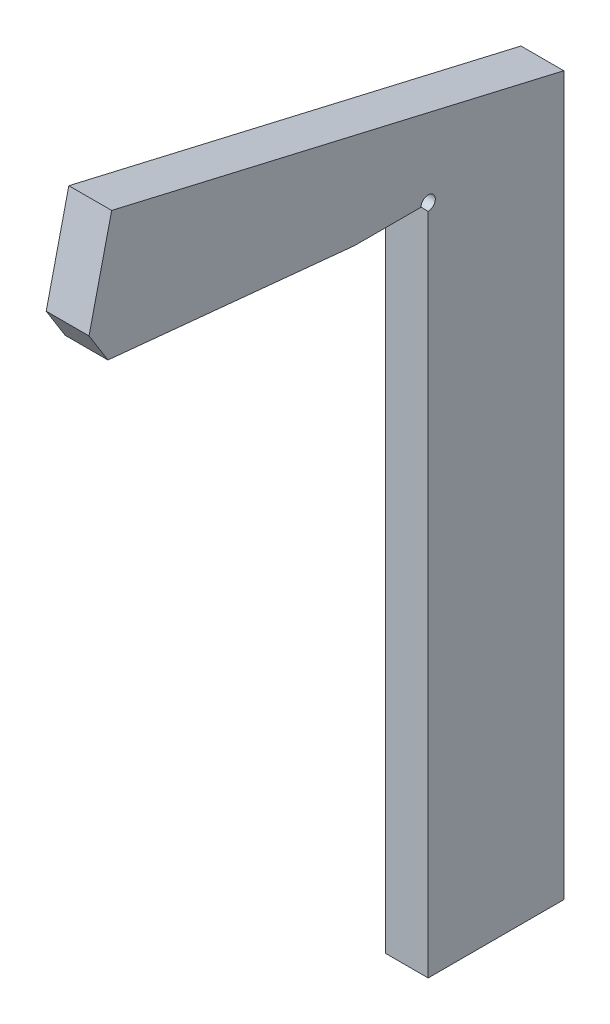
ISO-10303-21;
HEADER;
FILE_DESCRIPTION(('STEP AP214'),'2;1');
FILE_NAME('part.step','',(''),(''),'','','');
FILE_SCHEMA(('AUTOMOTIVE_DESIGN { 1 0 10303 214 1 1 1 1 }'));
ENDSEC;
DATA;
#1=APPLICATION_CONTEXT('core data for automotive mechanical design processes');
#2=APPLICATION_PROTOCOL_DEFINITION('international standard','automotive_design',2000,#1);
#3=PRODUCT_CONTEXT('',#1,'mechanical');
#4=PRODUCT('Part','Part','',(#3));
#5=PRODUCT_RELATED_PRODUCT_CATEGORY('part','',(#4));
#6=PRODUCT_DEFINITION_FORMATION('','',#4);
#7=PRODUCT_DEFINITION_CONTEXT('part definition',#1,'design');
#8=PRODUCT_DEFINITION('design','',#6,#7);
#9=PRODUCT_DEFINITION_SHAPE('','',#8);
#10=(LENGTH_UNIT() NAMED_UNIT(*) SI_UNIT(.MILLI.,.METRE.));
#11=(NAMED_UNIT(*) PLANE_ANGLE_UNIT() SI_UNIT($,.RADIAN.));
#12=(NAMED_UNIT(*) SI_UNIT($,.STERADIAN.) SOLID_ANGLE_UNIT());
#13=UNCERTAINTY_MEASURE_WITH_UNIT(LENGTH_MEASURE(1.E-05),#10,'distance_accuracy_value','');
#14=(GEOMETRIC_REPRESENTATION_CONTEXT(3) GLOBAL_UNCERTAINTY_ASSIGNED_CONTEXT((#13)) GLOBAL_UNIT_ASSIGNED_CONTEXT((#10,
#11,#12)) REPRESENTATION_CONTEXT('',''));
#15=CARTESIAN_POINT('',(0.,0.,0.));
#16=DIRECTION('',(0.,0.,1.));
#17=DIRECTION('',(1.,0.,0.));
#18=AXIS2_PLACEMENT_3D('',#15,#16,#17);
#19=CARTESIAN_POINT('',(-94.738766336441,-298.45,0.));
#20=DIRECTION('',(0.,0.,1.));
#21=DIRECTION('',(0.,-1.,0.));
#22=AXIS2_PLACEMENT_3D('',#19,#20,#21);
#23=PLANE('',#22);
#24=DIRECTION('',(0.,1.,0.));
#25=VECTOR('',#24,1.);
#26=CARTESIAN_POINT('',(-113.788766336441,-298.45,0.));
#27=LINE('',#26,#25);
#28=CARTESIAN_POINT('',(-113.788766336441,-298.45,0.));
#29=VERTEX_POINT('',#28);
#30=CARTESIAN_POINT('',(-113.788766336441,20.8246330030021,0.));
#31=VERTEX_POINT('',#30);
#32=EDGE_CURVE('E122',#29,#31,#27,.T.);
#33=ORIENTED_EDGE('',*,*,#32,.T.);
#34=DIRECTION('',(-1.,0.,0.));
#35=VECTOR('',#34,1.);
#36=CARTESIAN_POINT('',(-94.738766336441,20.8246330030021,0.));
#37=LINE('',#36,#35);
#38=CARTESIAN_POINT('',(-94.738766336441,20.8246330030021,0.));
#39=VERTEX_POINT('',#38);
#40=EDGE_CURVE('E161',#39,#31,#37,.T.);
#41=ORIENTED_EDGE('',*,*,#40,.F.);
#42=DIRECTION('',(0.,1.,0.));
#43=VECTOR('',#42,1.);
#44=CARTESIAN_POINT('',(-94.738766336441,-298.45,0.));
#45=LINE('',#44,#43);
#46=CARTESIAN_POINT('',(-94.738766336441,-298.45,0.));
#47=VERTEX_POINT('',#46);
#48=EDGE_CURVE('E113',#47,#39,#45,.T.);
#49=ORIENTED_EDGE('',*,*,#48,.F.);
#50=DIRECTION('',(-1.,0.,0.));
#51=VECTOR('',#50,1.);
#52=CARTESIAN_POINT('',(-94.738766336441,-298.45,0.));
#53=LINE('',#52,#51);
#54=EDGE_CURVE('E138',#47,#29,#53,.T.);
#55=ORIENTED_EDGE('',*,*,#54,.T.);
#56=EDGE_LOOP('',(#33,#41,#49,#55));
#57=FACE_BOUND('',#56,.T.);
#58=ADVANCED_FACE('F33',(#57),#23,.F.);
#59=CARTESIAN_POINT('',(-94.738766336441,20.8246330030021,0.));
#60=DIRECTION('',(0.,-0.974040610761285,0.22637333895091));
#61=DIRECTION('',(0.,-0.22637333895091,-0.974040610761285));
#62=AXIS2_PLACEMENT_3D('',#59,#60,#61);
#63=PLANE('',#62);
#64=DIRECTION('',(0.,0.22637333895091,0.974040610761284));
#65=VECTOR('',#64,1.);
#66=CARTESIAN_POINT('',(-113.788766336441,20.8246330030021,0.));
#67=LINE('',#66,#65);
#68=CARTESIAN_POINT('',(-113.788766336441,67.5582448491421,201.0856757101));
#69=VERTEX_POINT('',#68);
#70=EDGE_CURVE('E121',#31,#69,#67,.T.);
#71=ORIENTED_EDGE('',*,*,#70,.T.);
#72=DIRECTION('',(-1.,0.,0.));
#73=VECTOR('',#72,1.);
#74=CARTESIAN_POINT('',(-94.738766336441,67.5582448491421,201.0856757101));
#75=LINE('',#74,#73);
#76=CARTESIAN_POINT('',(-94.738766336441,67.5582448491421,201.0856757101));
#77=VERTEX_POINT('',#76);
#78=EDGE_CURVE('E104',#77,#69,#75,.T.);
#79=ORIENTED_EDGE('',*,*,#78,.F.);
#80=DIRECTION('',(0.,0.22637333895091,0.974040610761284));
#81=VECTOR('',#80,1.);
#82=CARTESIAN_POINT('',(-94.738766336441,20.8246330030021,0.));
#83=LINE('',#82,#81);
#84=EDGE_CURVE('E110',#39,#77,#83,.T.);
#85=ORIENTED_EDGE('',*,*,#84,.F.);
#86=ORIENTED_EDGE('',*,*,#40,.T.);
#87=EDGE_LOOP('',(#71,#79,#85,#86));
#88=FACE_BOUND('',#87,.T.);
#89=ADVANCED_FACE('F120',(#88),#63,.F.);
#90=CARTESIAN_POINT('',(-94.738766336441,0.,93.1961939808879));
#91=DIRECTION('',(0.,1.,0.));
#92=DIRECTION('',(0.,0.,1.));
#93=AXIS2_PLACEMENT_3D('',#90,#91,#92);
#94=PLANE('',#93);
#95=DIRECTION('',(0.,0.,-1.));
#96=VECTOR('',#95,1.);
#97=CARTESIAN_POINT('',(-113.788766336441,0.,93.1961939808879));
#98=LINE('',#97,#96);
#99=CARTESIAN_POINT('',(-113.788766336441,0.,93.1961939808879));
#100=VERTEX_POINT('',#99);
#101=CARTESIAN_POINT('',(-113.788766336441,8.23729306522208E-13,63.5));
#102=VERTEX_POINT('',#101);
#103=EDGE_CURVE('E141',#100,#102,#98,.T.);
#104=ORIENTED_EDGE('',*,*,#103,.T.);
#105=DIRECTION('',(-1.,0.,0.));
#106=VECTOR('',#105,1.);
#107=CARTESIAN_POINT('',(-94.738766336441,8.23729306522208E-13,63.5));
#108=LINE('',#107,#106);
#109=CARTESIAN_POINT('',(-94.738766336441,8.23729306522208E-13,63.5));
#110=VERTEX_POINT('',#109);
#111=EDGE_CURVE('E156',#110,#102,#108,.T.);
#112=ORIENTED_EDGE('',*,*,#111,.F.);
#113=DIRECTION('',(0.,0.,-1.));
#114=VECTOR('',#113,1.);
#115=CARTESIAN_POINT('',(-94.738766336441,0.,93.1961939808879));
#116=LINE('',#115,#114);
#117=CARTESIAN_POINT('',(-94.738766336441,0.,93.1961939808879));
#118=VERTEX_POINT('',#117);
#119=EDGE_CURVE('E117',#118,#110,#116,.T.);
#120=ORIENTED_EDGE('',*,*,#119,.F.);
#121=DIRECTION('',(-1.,0.,0.));
#122=VECTOR('',#121,1.);
#123=CARTESIAN_POINT('',(-94.738766336441,0.,93.1961939808879));
#124=LINE('',#123,#122);
#125=EDGE_CURVE('E159',#118,#100,#124,.T.);
#126=ORIENTED_EDGE('',*,*,#125,.T.);
#127=EDGE_LOOP('',(#104,#112,#120,#126));
#128=FACE_BOUND('',#127,.T.);
#129=ADVANCED_FACE('F184',(#128),#94,.F.);
#130=CARTESIAN_POINT('',(-94.738766336441,0.,60.325));
#131=DIRECTION('',(-1.,0.,0.));
#132=DIRECTION('',(0.,0.,1.));
#133=AXIS2_PLACEMENT_3D('',#130,#131,#132);
#134=CYLINDRICAL_SURFACE('',#133,3.17499999999999);
#135=CARTESIAN_POINT('',(-113.788766336441,0.,60.325));
#136=DIRECTION('',(-1.,0.,0.));
#137=DIRECTION('',(0.,0.,-1.));
#138=AXIS2_PLACEMENT_3D('',#135,#136,#137);
#139=CIRCLE('',#138,3.17499999999999);
#140=CARTESIAN_POINT('',(-113.788766336441,-3.17500000000002,60.325));
#141=VERTEX_POINT('',#140);
#142=EDGE_CURVE('E143',#102,#141,#139,.T.);
#143=ORIENTED_EDGE('',*,*,#142,.T.);
#144=DIRECTION('',(-1.,0.,0.));
#145=VECTOR('',#144,1.);
#146=CARTESIAN_POINT('',(-94.738766336441,-3.17500000000002,60.325));
#147=LINE('',#146,#145);
#148=CARTESIAN_POINT('',(-94.738766336441,-3.17500000000002,60.325));
#149=VERTEX_POINT('',#148);
#150=EDGE_CURVE('E153',#149,#141,#147,.T.);
#151=ORIENTED_EDGE('',*,*,#150,.F.);
#152=CARTESIAN_POINT('',(-94.738766336441,0.,60.325));
#153=DIRECTION('',(-1.,0.,0.));
#154=DIRECTION('',(0.,0.,-1.));
#155=AXIS2_PLACEMENT_3D('',#152,#153,#154);
#156=CIRCLE('',#155,3.17499999999999);
#157=EDGE_CURVE('E133',#110,#149,#156,.T.);
#158=ORIENTED_EDGE('',*,*,#157,.F.);
#159=ORIENTED_EDGE('',*,*,#111,.T.);
#160=EDGE_LOOP('',(#143,#151,#158,#159));
#161=FACE_BOUND('',#160,.T.);
#162=ADVANCED_FACE('F186',(#161),#134,.F.);
#163=CARTESIAN_POINT('',(-94.738766336441,-3.17500000000002,60.325));
#164=DIRECTION('',(0.,0.,-1.));
#165=DIRECTION('',(-1.,0.,0.));
#166=AXIS2_PLACEMENT_3D('',#163,#164,#165);
#167=PLANE('',#166);
#168=DIRECTION('',(0.,-1.,0.));
#169=VECTOR('',#168,1.);
#170=CARTESIAN_POINT('',(-113.788766336441,-3.17500000000002,60.325));
#171=LINE('',#170,#169);
#172=CARTESIAN_POINT('',(-113.788766336441,-298.45,60.325));
#173=VERTEX_POINT('',#172);
#174=EDGE_CURVE('E145',#141,#173,#171,.T.);
#175=ORIENTED_EDGE('',*,*,#174,.T.);
#176=DIRECTION('',(-1.,0.,0.));
#177=VECTOR('',#176,1.);
#178=CARTESIAN_POINT('',(-94.738766336441,-298.45,60.325));
#179=LINE('',#178,#177);
#180=CARTESIAN_POINT('',(-94.738766336441,-298.45,60.325));
#181=VERTEX_POINT('',#180);
#182=EDGE_CURVE('E150',#181,#173,#179,.T.);
#183=ORIENTED_EDGE('',*,*,#182,.F.);
#184=DIRECTION('',(0.,-1.,0.));
#185=VECTOR('',#184,1.);
#186=CARTESIAN_POINT('',(-94.738766336441,-3.17500000000002,60.325));
#187=LINE('',#186,#185);
#188=EDGE_CURVE('E135',#149,#181,#187,.T.);
#189=ORIENTED_EDGE('',*,*,#188,.F.);
#190=ORIENTED_EDGE('',*,*,#150,.T.);
#191=EDGE_LOOP('',(#175,#183,#189,#190));
#192=FACE_BOUND('',#191,.T.);
#193=ADVANCED_FACE('F191',(#192),#167,.F.);
#194=CARTESIAN_POINT('',(-94.738766336441,-298.45,0.));
#195=DIRECTION('',(0.,1.,0.));
#196=DIRECTION('',(0.,0.,1.));
#197=AXIS2_PLACEMENT_3D('',#194,#195,#196);
#198=PLANE('',#197);
#199=DIRECTION('',(0.,0.,-1.));
#200=VECTOR('',#199,1.);
#201=CARTESIAN_POINT('',(-113.788766336441,-298.45,0.));
#202=LINE('',#201,#200);
#203=EDGE_CURVE('E130',#173,#29,#202,.T.);
#204=ORIENTED_EDGE('',*,*,#203,.T.);
#205=ORIENTED_EDGE('',*,*,#54,.F.);
#206=DIRECTION('',(0.,0.,-1.));
#207=VECTOR('',#206,1.);
#208=CARTESIAN_POINT('',(-94.738766336441,-298.45,0.));
#209=LINE('',#208,#207);
#210=EDGE_CURVE('E137',#181,#47,#209,.T.);
#211=ORIENTED_EDGE('',*,*,#210,.F.);
#212=ORIENTED_EDGE('',*,*,#182,.T.);
#213=EDGE_LOOP('',(#204,#205,#211,#212));
#214=FACE_BOUND('',#213,.T.);
#215=ADVANCED_FACE('F195',(#214),#198,.F.);
#216=CARTESIAN_POINT('',(-94.738766336441,0.,60.325));
#217=DIRECTION('',(1.,0.,0.));
#218=DIRECTION('',(0.,0.,-1.));
#219=AXIS2_PLACEMENT_3D('',#216,#217,#218);
#220=PLANE('',#219);
#221=DIRECTION('',(0.,0.974040610761284,-0.226373338950911));
#222=VECTOR('',#221,1.);
#223=CARTESIAN_POINT('',(-94.738766336441,67.5582448491421,201.0856757101));
#224=LINE('',#223,#222);
#225=CARTESIAN_POINT('',(-94.738766336441,24.2621397008031,211.147970626468));
#226=VERTEX_POINT('',#225);
#227=EDGE_CURVE('E100',#226,#77,#224,.T.);
#228=ORIENTED_EDGE('',*,*,#227,.F.);
#229=DIRECTION('',(0.,0.848820844072422,0.528680597968359));
#230=VECTOR('',#229,1.);
#231=CARTESIAN_POINT('',(-94.738766336441,-60.9012339163843,158.104712318951));
#232=LINE('',#231,#230);
#233=CARTESIAN_POINT('',(-94.738766336441,10.7825686375829,202.752338332767));
#234=VERTEX_POINT('',#233);
#235=EDGE_CURVE('E11',#226,#234,#232,.F.);
#236=ORIENTED_EDGE('',*,*,#235,.T.);
#237=DIRECTION('',(0.,0.0979472387782762,0.995191608895348));
#238=VECTOR('',#237,1.);
#239=CARTESIAN_POINT('',(-94.738766336441,0.,93.19619398089));
#240=LINE('',#239,#238);
#241=EDGE_CURVE('E107',#118,#234,#240,.T.);
#242=ORIENTED_EDGE('',*,*,#241,.F.);
#243=ORIENTED_EDGE('',*,*,#119,.T.);
#244=ORIENTED_EDGE('',*,*,#157,.T.);
#245=ORIENTED_EDGE('',*,*,#188,.T.);
#246=ORIENTED_EDGE('',*,*,#210,.T.);
#247=ORIENTED_EDGE('',*,*,#48,.T.);
#248=ORIENTED_EDGE('',*,*,#84,.T.);
#249=EDGE_LOOP('',(#228,#236,#242,#243,#244,#245,#246,#247,#248));
#250=FACE_BOUND('',#249,.T.);
#251=ADVANCED_FACE('F111',(#250),#220,.T.);
#252=CARTESIAN_POINT('',(-113.788766336441,0.,60.325));
#253=DIRECTION('',(1.,0.,0.));
#254=DIRECTION('',(0.,0.,-1.));
#255=AXIS2_PLACEMENT_3D('',#252,#253,#254);
#256=PLANE('',#255);
#257=DIRECTION('',(0.,0.0979472387782762,0.995191608895348));
#258=VECTOR('',#257,1.);
#259=CARTESIAN_POINT('',(-113.788766336441,0.,93.19619398089));
#260=LINE('',#259,#258);
#261=CARTESIAN_POINT('',(-113.788766336441,10.7825686375829,202.752338332767));
#262=VERTEX_POINT('',#261);
#263=EDGE_CURVE('E172',#100,#262,#260,.T.);
#264=ORIENTED_EDGE('',*,*,#263,.T.);
#265=DIRECTION('',(0.,-0.848820844072422,-0.528680597968359));
#266=VECTOR('',#265,1.);
#267=CARTESIAN_POINT('',(-113.788766336441,10.7825686375829,202.752338332767));
#268=LINE('',#267,#266);
#269=CARTESIAN_POINT('',(-113.788766336441,24.2621397008031,211.147970626468));
#270=VERTEX_POINT('',#269);
#271=EDGE_CURVE('E55',#262,#270,#268,.F.);
#272=ORIENTED_EDGE('',*,*,#271,.T.);
#273=DIRECTION('',(0.,0.974040610761284,-0.226373338950911));
#274=VECTOR('',#273,1.);
#275=CARTESIAN_POINT('',(-113.788766336441,67.5582448491421,201.0856757101));
#276=LINE('',#275,#274);
#277=EDGE_CURVE('E128',#270,#69,#276,.T.);
#278=ORIENTED_EDGE('',*,*,#277,.T.);
#279=ORIENTED_EDGE('',*,*,#70,.F.);
#280=ORIENTED_EDGE('',*,*,#32,.F.);
#281=ORIENTED_EDGE('',*,*,#203,.F.);
#282=ORIENTED_EDGE('',*,*,#174,.F.);
#283=ORIENTED_EDGE('',*,*,#142,.F.);
#284=ORIENTED_EDGE('',*,*,#103,.F.);
#285=EDGE_LOOP('',(#264,#272,#278,#279,#280,#281,#282,#283,#284));
#286=FACE_BOUND('',#285,.T.);
#287=ADVANCED_FACE('F176',(#286),#256,.F.);
#288=CARTESIAN_POINT('',(-94.738766336441,67.5582448491421,201.0856757101));
#289=DIRECTION('',(0.,0.226373338950911,0.974040610761284));
#290=DIRECTION('',(0.,-0.974040610761284,0.226373338950911));
#291=AXIS2_PLACEMENT_3D('',#288,#289,#290);
#292=PLANE('',#291);
#293=ORIENTED_EDGE('',*,*,#277,.F.);
#294=DIRECTION('',(1.,0.,0.));
#295=VECTOR('',#294,1.);
#296=CARTESIAN_POINT('',(-94.738766336441,24.2621397008031,211.147970626468));
#297=LINE('',#296,#295);
#298=EDGE_CURVE('E41',#270,#226,#297,.T.);
#299=ORIENTED_EDGE('',*,*,#298,.T.);
#300=ORIENTED_EDGE('',*,*,#227,.T.);
#301=ORIENTED_EDGE('',*,*,#78,.T.);
#302=EDGE_LOOP('',(#293,#299,#300,#301));
#303=FACE_BOUND('',#302,.T.);
#304=ADVANCED_FACE('F102',(#303),#292,.T.);
#305=CARTESIAN_POINT('',(-94.738766336441,0.,93.19619398089));
#306=DIRECTION('',(0.,-0.995191608895348,0.0979472387782762));
#307=DIRECTION('',(0.,-0.0979472387782762,-0.995191608895348));
#308=AXIS2_PLACEMENT_3D('',#305,#306,#307);
#309=PLANE('',#308);
#310=ORIENTED_EDGE('',*,*,#241,.T.);
#311=DIRECTION('',(-1.,0.,0.));
#312=VECTOR('',#311,1.);
#313=CARTESIAN_POINT('',(-94.738766336441,10.7825686375829,202.752338332767));
#314=LINE('',#313,#312);
#315=EDGE_CURVE('E163',#234,#262,#314,.T.);
#316=ORIENTED_EDGE('',*,*,#315,.T.);
#317=ORIENTED_EDGE('',*,*,#263,.F.);
#318=ORIENTED_EDGE('',*,*,#125,.F.);
#319=EDGE_LOOP('',(#310,#316,#317,#318));
#320=FACE_BOUND('',#319,.T.);
#321=ADVANCED_FACE('F170',(#320),#309,.T.);
#322=CARTESIAN_POINT('',(-94.738766336441,10.7825686375829,202.752338332767));
#323=DIRECTION('',(0.,0.528680597968359,-0.848820844072422));
#324=DIRECTION('',(-1.,0.,0.));
#325=AXIS2_PLACEMENT_3D('',#322,#323,#324);
#326=PLANE('',#325);
#327=ORIENTED_EDGE('',*,*,#235,.F.);
#328=ORIENTED_EDGE('',*,*,#298,.F.);
#329=ORIENTED_EDGE('',*,*,#271,.F.);
#330=ORIENTED_EDGE('',*,*,#315,.F.);
#331=EDGE_LOOP('',(#327,#328,#329,#330));
#332=FACE_BOUND('',#331,.T.);
#333=ADVANCED_FACE('F35',(#332),#326,.F.);
#334=CLOSED_SHELL('',(#58,#89,#129,#162,#193,#215,#251,#287,#304,#321,#333));
#335=MANIFOLD_SOLID_BREP('B2',#334);
#336=ADVANCED_BREP_SHAPE_REPRESENTATION('',(#18,#335),#14);
#337=SHAPE_DEFINITION_REPRESENTATION(#9,#336);
ENDSEC;
END-ISO-10303-21;
